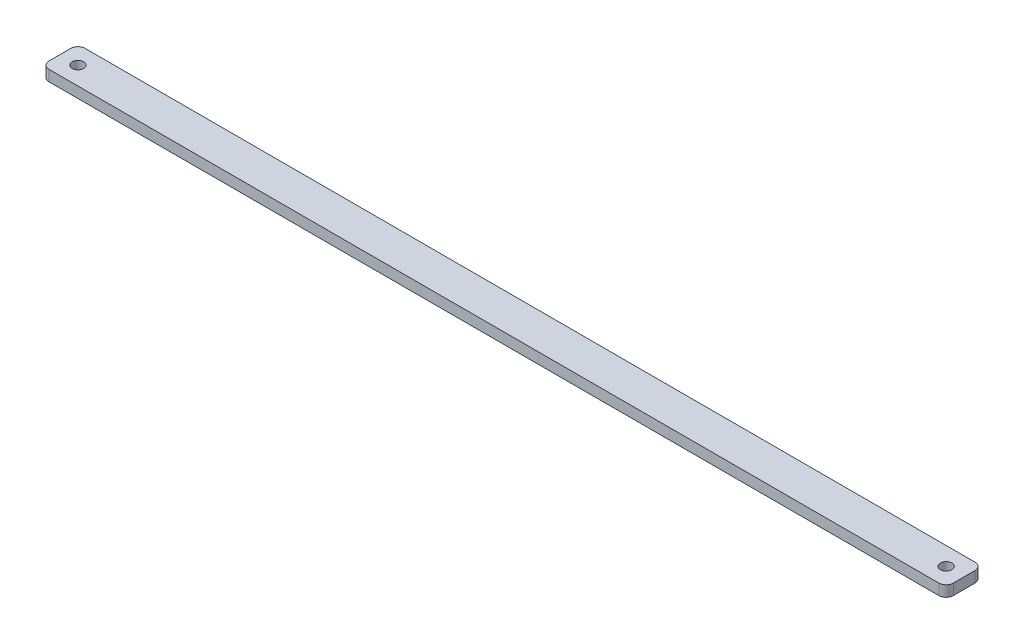
ISO-10303-21;
HEADER;
FILE_DESCRIPTION(('STEP AP214'),'2;1');
FILE_NAME('part.step','',(''),(''),'','','');
FILE_SCHEMA(('AUTOMOTIVE_DESIGN { 1 0 10303 214 1 1 1 1 }'));
ENDSEC;
DATA;
#1=APPLICATION_CONTEXT('core data for automotive mechanical design processes');
#2=APPLICATION_PROTOCOL_DEFINITION('international standard','automotive_design',2000,#1);
#3=PRODUCT_CONTEXT('',#1,'mechanical');
#4=PRODUCT('Part','Part','',(#3));
#5=PRODUCT_RELATED_PRODUCT_CATEGORY('part','',(#4));
#6=PRODUCT_DEFINITION_FORMATION('','',#4);
#7=PRODUCT_DEFINITION_CONTEXT('part definition',#1,'design');
#8=PRODUCT_DEFINITION('design','',#6,#7);
#9=PRODUCT_DEFINITION_SHAPE('','',#8);
#10=(LENGTH_UNIT() NAMED_UNIT(*) SI_UNIT(.MILLI.,.METRE.));
#11=(NAMED_UNIT(*) PLANE_ANGLE_UNIT() SI_UNIT($,.RADIAN.));
#12=(NAMED_UNIT(*) SI_UNIT($,.STERADIAN.) SOLID_ANGLE_UNIT());
#13=UNCERTAINTY_MEASURE_WITH_UNIT(LENGTH_MEASURE(1.E-05),#10,'distance_accuracy_value','');
#14=(GEOMETRIC_REPRESENTATION_CONTEXT(3) GLOBAL_UNCERTAINTY_ASSIGNED_CONTEXT((#13)) GLOBAL_UNIT_ASSIGNED_CONTEXT((#10,
#11,#12)) REPRESENTATION_CONTEXT('',''));
#15=CARTESIAN_POINT('',(0.,0.,0.));
#16=DIRECTION('',(0.,0.,1.));
#17=DIRECTION('',(1.,0.,0.));
#18=AXIS2_PLACEMENT_3D('',#15,#16,#17);
#19=CARTESIAN_POINT('',(0.,3.,0.));
#20=DIRECTION('',(0.,1.,0.));
#21=DIRECTION('',(0.,0.,1.));
#22=AXIS2_PLACEMENT_3D('',#19,#20,#21);
#23=PLANE('',#22);
#24=CARTESIAN_POINT('',(-120.,3.,0.));
#25=DIRECTION('',(0.,1.,0.));
#26=DIRECTION('',(0.,0.,1.));
#27=AXIS2_PLACEMENT_3D('',#24,#25,#26);
#28=CIRCLE('',#27,1.60000000000001);
#29=CARTESIAN_POINT('',(-120.,3.,1.60000000000002));
#30=VERTEX_POINT('',#29);
#31=EDGE_CURVE('E165',#30,#30,#28,.T.);
#32=ORIENTED_EDGE('',*,*,#31,.F.);
#33=EDGE_LOOP('',(#32));
#34=FACE_BOUND('',#33,.T.);
#35=DIRECTION('',(1.,0.,0.));
#36=VECTOR('',#35,1.);
#37=CARTESIAN_POINT('',(-125.,3.,5.00000000000002));
#38=LINE('',#37,#36);
#39=CARTESIAN_POINT('',(-123.,3.,5.00000000000002));
#40=VERTEX_POINT('',#39);
#41=CARTESIAN_POINT('',(123.,3.,5.00000000000002));
#42=VERTEX_POINT('',#41);
#43=EDGE_CURVE('E123',#40,#42,#38,.T.);
#44=ORIENTED_EDGE('',*,*,#43,.T.);
#45=CARTESIAN_POINT('',(123.,3.,3.00000000000002));
#46=DIRECTION('',(0.,1.,0.));
#47=DIRECTION('',(0.,0.,1.));
#48=AXIS2_PLACEMENT_3D('',#45,#46,#47);
#49=CIRCLE('',#48,2.);
#50=CARTESIAN_POINT('',(125.,3.,3.00000000000002));
#51=VERTEX_POINT('',#50);
#52=EDGE_CURVE('E156',#42,#51,#49,.T.);
#53=ORIENTED_EDGE('',*,*,#52,.T.);
#54=DIRECTION('',(0.,0.,-1.));
#55=VECTOR('',#54,1.);
#56=CARTESIAN_POINT('',(125.,3.,-4.99999999999999));
#57=LINE('',#56,#55);
#58=CARTESIAN_POINT('',(125.,3.,-2.99999999999998));
#59=VERTEX_POINT('',#58);
#60=EDGE_CURVE('E129',#51,#59,#57,.T.);
#61=ORIENTED_EDGE('',*,*,#60,.T.);
#62=CARTESIAN_POINT('',(123.,3.,-2.99999999999999));
#63=DIRECTION('',(0.,1.,0.));
#64=DIRECTION('',(0.,0.,1.));
#65=AXIS2_PLACEMENT_3D('',#62,#63,#64);
#66=CIRCLE('',#65,2.);
#67=CARTESIAN_POINT('',(123.,3.,-4.99999999999999));
#68=VERTEX_POINT('',#67);
#69=EDGE_CURVE('E59',#59,#68,#66,.T.);
#70=ORIENTED_EDGE('',*,*,#69,.T.);
#71=DIRECTION('',(-1.,0.,0.));
#72=VECTOR('',#71,1.);
#73=CARTESIAN_POINT('',(-125.,3.,-4.99999999999999));
#74=LINE('',#73,#72);
#75=CARTESIAN_POINT('',(-123.,3.,-4.99999999999999));
#76=VERTEX_POINT('',#75);
#77=EDGE_CURVE('E132',#68,#76,#74,.T.);
#78=ORIENTED_EDGE('',*,*,#77,.T.);
#79=CARTESIAN_POINT('',(-123.,3.,-2.99999999999999));
#80=DIRECTION('',(0.,1.,0.));
#81=DIRECTION('',(0.,0.,1.));
#82=AXIS2_PLACEMENT_3D('',#79,#80,#81);
#83=CIRCLE('',#82,2.);
#84=CARTESIAN_POINT('',(-125.,3.,-2.99999999999999));
#85=VERTEX_POINT('',#84);
#86=EDGE_CURVE('E153',#76,#85,#83,.T.);
#87=ORIENTED_EDGE('',*,*,#86,.T.);
#88=DIRECTION('',(0.,0.,1.));
#89=VECTOR('',#88,1.);
#90=CARTESIAN_POINT('',(-125.,3.,-4.99999999999999));
#91=LINE('',#90,#89);
#92=CARTESIAN_POINT('',(-125.,3.,3.00000000000002));
#93=VERTEX_POINT('',#92);
#94=EDGE_CURVE('E169',#85,#93,#91,.T.);
#95=ORIENTED_EDGE('',*,*,#94,.T.);
#96=CARTESIAN_POINT('',(-123.,3.,3.00000000000002));
#97=DIRECTION('',(0.,1.,0.));
#98=DIRECTION('',(0.,0.,1.));
#99=AXIS2_PLACEMENT_3D('',#96,#97,#98);
#100=CIRCLE('',#99,2.);
#101=EDGE_CURVE('E139',#93,#40,#100,.T.);
#102=ORIENTED_EDGE('',*,*,#101,.T.);
#103=EDGE_LOOP('',(#44,#53,#61,#70,#78,#87,#95,#102));
#104=FACE_BOUND('',#103,.T.);
#105=CARTESIAN_POINT('',(120.,3.,0.));
#106=DIRECTION('',(0.,1.,0.));
#107=DIRECTION('',(0.,0.,1.));
#108=AXIS2_PLACEMENT_3D('',#105,#106,#107);
#109=CIRCLE('',#108,1.60000000000001);
#110=CARTESIAN_POINT('',(120.,3.,1.59999999999999));
#111=VERTEX_POINT('',#110);
#112=EDGE_CURVE('E175',#111,#111,#109,.T.);
#113=ORIENTED_EDGE('',*,*,#112,.F.);
#114=EDGE_LOOP('',(#113));
#115=FACE_BOUND('',#114,.T.);
#116=ADVANCED_FACE('F37',(#34,#104,#115),#23,.T.);
#117=CARTESIAN_POINT('',(0.,0.,0.));
#118=DIRECTION('',(0.,1.,0.));
#119=DIRECTION('',(0.,0.,1.));
#120=AXIS2_PLACEMENT_3D('',#117,#118,#119);
#121=PLANE('',#120);
#122=DIRECTION('',(0.,0.,-1.));
#123=VECTOR('',#122,1.);
#124=CARTESIAN_POINT('',(125.,0.,-4.99999999999999));
#125=LINE('',#124,#123);
#126=CARTESIAN_POINT('',(125.,0.,3.00000000000002));
#127=VERTEX_POINT('',#126);
#128=CARTESIAN_POINT('',(125.,0.,-2.99999999999998));
#129=VERTEX_POINT('',#128);
#130=EDGE_CURVE('E164',#127,#129,#125,.T.);
#131=ORIENTED_EDGE('',*,*,#130,.F.);
#132=CARTESIAN_POINT('',(123.,0.,3.00000000000002));
#133=DIRECTION('',(0.,1.,0.));
#134=DIRECTION('',(0.,0.,1.));
#135=AXIS2_PLACEMENT_3D('',#132,#133,#134);
#136=CIRCLE('',#135,2.);
#137=CARTESIAN_POINT('',(123.,0.,5.00000000000002));
#138=VERTEX_POINT('',#137);
#139=EDGE_CURVE('E128',#127,#138,#136,.F.);
#140=ORIENTED_EDGE('',*,*,#139,.T.);
#141=DIRECTION('',(1.,0.,0.));
#142=VECTOR('',#141,1.);
#143=CARTESIAN_POINT('',(-125.,0.,5.00000000000002));
#144=LINE('',#143,#142);
#145=CARTESIAN_POINT('',(-123.,0.,5.00000000000002));
#146=VERTEX_POINT('',#145);
#147=EDGE_CURVE('E120',#146,#138,#144,.T.);
#148=ORIENTED_EDGE('',*,*,#147,.F.);
#149=CARTESIAN_POINT('',(-123.,0.,3.00000000000002));
#150=DIRECTION('',(0.,1.,0.));
#151=DIRECTION('',(0.,0.,1.));
#152=AXIS2_PLACEMENT_3D('',#149,#150,#151);
#153=CIRCLE('',#152,2.);
#154=CARTESIAN_POINT('',(-125.,0.,3.00000000000002));
#155=VERTEX_POINT('',#154);
#156=EDGE_CURVE('E105',#146,#155,#153,.F.);
#157=ORIENTED_EDGE('',*,*,#156,.T.);
#158=DIRECTION('',(0.,0.,1.));
#159=VECTOR('',#158,1.);
#160=CARTESIAN_POINT('',(-125.,0.,-4.99999999999999));
#161=LINE('',#160,#159);
#162=CARTESIAN_POINT('',(-125.,0.,-2.99999999999999));
#163=VERTEX_POINT('',#162);
#164=EDGE_CURVE('E130',#163,#155,#161,.T.);
#165=ORIENTED_EDGE('',*,*,#164,.F.);
#166=CARTESIAN_POINT('',(-123.,0.,-2.99999999999999));
#167=DIRECTION('',(0.,1.,0.));
#168=DIRECTION('',(0.,0.,1.));
#169=AXIS2_PLACEMENT_3D('',#166,#167,#168);
#170=CIRCLE('',#169,2.);
#171=CARTESIAN_POINT('',(-123.,0.,-4.99999999999999));
#172=VERTEX_POINT('',#171);
#173=EDGE_CURVE('E146',#163,#172,#170,.F.);
#174=ORIENTED_EDGE('',*,*,#173,.T.);
#175=DIRECTION('',(-1.,0.,0.));
#176=VECTOR('',#175,1.);
#177=CARTESIAN_POINT('',(-125.,0.,-4.99999999999999));
#178=LINE('',#177,#176);
#179=CARTESIAN_POINT('',(123.,0.,-4.99999999999999));
#180=VERTEX_POINT('',#179);
#181=EDGE_CURVE('E134',#180,#172,#178,.T.);
#182=ORIENTED_EDGE('',*,*,#181,.F.);
#183=CARTESIAN_POINT('',(123.,0.,-2.99999999999999));
#184=DIRECTION('',(0.,1.,0.));
#185=DIRECTION('',(0.,0.,1.));
#186=AXIS2_PLACEMENT_3D('',#183,#184,#185);
#187=CIRCLE('',#186,2.);
#188=EDGE_CURVE('E148',#180,#129,#187,.F.);
#189=ORIENTED_EDGE('',*,*,#188,.T.);
#190=EDGE_LOOP('',(#131,#140,#148,#157,#165,#174,#182,#189));
#191=FACE_BOUND('',#190,.T.);
#192=CARTESIAN_POINT('',(-120.,0.,0.));
#193=DIRECTION('',(0.,1.,0.));
#194=DIRECTION('',(0.,0.,1.));
#195=AXIS2_PLACEMENT_3D('',#192,#193,#194);
#196=CIRCLE('',#195,1.60000000000001);
#197=CARTESIAN_POINT('',(-120.,0.,1.60000000000002));
#198=VERTEX_POINT('',#197);
#199=EDGE_CURVE('E172',#198,#198,#196,.T.);
#200=ORIENTED_EDGE('',*,*,#199,.T.);
#201=EDGE_LOOP('',(#200));
#202=FACE_BOUND('',#201,.T.);
#203=CARTESIAN_POINT('',(120.,0.,0.));
#204=DIRECTION('',(0.,1.,0.));
#205=DIRECTION('',(0.,0.,1.));
#206=AXIS2_PLACEMENT_3D('',#203,#204,#205);
#207=CIRCLE('',#206,1.60000000000001);
#208=CARTESIAN_POINT('',(120.,0.,1.59999999999999));
#209=VERTEX_POINT('',#208);
#210=EDGE_CURVE('E178',#209,#209,#207,.T.);
#211=ORIENTED_EDGE('',*,*,#210,.T.);
#212=EDGE_LOOP('',(#211));
#213=FACE_BOUND('',#212,.T.);
#214=ADVANCED_FACE('F126',(#191,#202,#213),#121,.F.);
#215=CARTESIAN_POINT('',(125.,3.,-4.99999999999999));
#216=DIRECTION('',(-1.,0.,0.));
#217=DIRECTION('',(0.,0.,1.));
#218=AXIS2_PLACEMENT_3D('',#215,#216,#217);
#219=PLANE('',#218);
#220=ORIENTED_EDGE('',*,*,#60,.F.);
#221=DIRECTION('',(0.,-1.,0.));
#222=VECTOR('',#221,1.);
#223=CARTESIAN_POINT('',(125.,3.,3.00000000000002));
#224=LINE('',#223,#222);
#225=EDGE_CURVE('E143',#51,#127,#224,.T.);
#226=ORIENTED_EDGE('',*,*,#225,.T.);
#227=ORIENTED_EDGE('',*,*,#130,.T.);
#228=DIRECTION('',(0.,-1.,0.));
#229=VECTOR('',#228,1.);
#230=CARTESIAN_POINT('',(125.,3.,-2.99999999999998));
#231=LINE('',#230,#229);
#232=EDGE_CURVE('E141',#129,#59,#231,.F.);
#233=ORIENTED_EDGE('',*,*,#232,.T.);
#234=EDGE_LOOP('',(#220,#226,#227,#233));
#235=FACE_BOUND('',#234,.T.);
#236=ADVANCED_FACE('F193',(#235),#219,.F.);
#237=CARTESIAN_POINT('',(-125.,3.,-4.99999999999999));
#238=DIRECTION('',(0.,0.,1.));
#239=DIRECTION('',(1.,0.,0.));
#240=AXIS2_PLACEMENT_3D('',#237,#238,#239);
#241=PLANE('',#240);
#242=ORIENTED_EDGE('',*,*,#77,.F.);
#243=DIRECTION('',(0.,-1.,0.));
#244=VECTOR('',#243,1.);
#245=CARTESIAN_POINT('',(123.,3.,-4.99999999999999));
#246=LINE('',#245,#244);
#247=EDGE_CURVE('E45',#68,#180,#246,.T.);
#248=ORIENTED_EDGE('',*,*,#247,.T.);
#249=ORIENTED_EDGE('',*,*,#181,.T.);
#250=DIRECTION('',(0.,-1.,0.));
#251=VECTOR('',#250,1.);
#252=CARTESIAN_POINT('',(-123.,3.,-4.99999999999999));
#253=LINE('',#252,#251);
#254=EDGE_CURVE('E52',#172,#76,#253,.F.);
#255=ORIENTED_EDGE('',*,*,#254,.T.);
#256=EDGE_LOOP('',(#242,#248,#249,#255));
#257=FACE_BOUND('',#256,.T.);
#258=ADVANCED_FACE('F161',(#257),#241,.F.);
#259=CARTESIAN_POINT('',(-125.,3.,-4.99999999999999));
#260=DIRECTION('',(1.,0.,0.));
#261=DIRECTION('',(0.,0.,-1.));
#262=AXIS2_PLACEMENT_3D('',#259,#260,#261);
#263=PLANE('',#262);
#264=ORIENTED_EDGE('',*,*,#94,.F.);
#265=DIRECTION('',(0.,-1.,0.));
#266=VECTOR('',#265,1.);
#267=CARTESIAN_POINT('',(-125.,3.,-2.99999999999999));
#268=LINE('',#267,#266);
#269=EDGE_CURVE('E11',#85,#163,#268,.T.);
#270=ORIENTED_EDGE('',*,*,#269,.T.);
#271=ORIENTED_EDGE('',*,*,#164,.T.);
#272=DIRECTION('',(0.,-1.,0.));
#273=VECTOR('',#272,1.);
#274=CARTESIAN_POINT('',(-125.,3.,3.00000000000002));
#275=LINE('',#274,#273);
#276=EDGE_CURVE('E111',#155,#93,#275,.F.);
#277=ORIENTED_EDGE('',*,*,#276,.T.);
#278=EDGE_LOOP('',(#264,#270,#271,#277));
#279=FACE_BOUND('',#278,.T.);
#280=ADVANCED_FACE('F202',(#279),#263,.F.);
#281=CARTESIAN_POINT('',(-125.,3.,5.00000000000002));
#282=DIRECTION('',(0.,0.,-1.));
#283=DIRECTION('',(-1.,0.,0.));
#284=AXIS2_PLACEMENT_3D('',#281,#282,#283);
#285=PLANE('',#284);
#286=ORIENTED_EDGE('',*,*,#147,.T.);
#287=DIRECTION('',(0.,-1.,0.));
#288=VECTOR('',#287,1.);
#289=CARTESIAN_POINT('',(123.,3.,5.00000000000002));
#290=LINE('',#289,#288);
#291=EDGE_CURVE('E151',#138,#42,#290,.F.);
#292=ORIENTED_EDGE('',*,*,#291,.T.);
#293=ORIENTED_EDGE('',*,*,#43,.F.);
#294=DIRECTION('',(0.,-1.,0.));
#295=VECTOR('',#294,1.);
#296=CARTESIAN_POINT('',(-123.,3.,5.00000000000002));
#297=LINE('',#296,#295);
#298=EDGE_CURVE('E109',#40,#146,#297,.T.);
#299=ORIENTED_EDGE('',*,*,#298,.T.);
#300=EDGE_LOOP('',(#286,#292,#293,#299));
#301=FACE_BOUND('',#300,.T.);
#302=ADVANCED_FACE('F119',(#301),#285,.F.);
#303=CARTESIAN_POINT('',(-120.,3.,0.));
#304=DIRECTION('',(0.,-1.,0.));
#305=DIRECTION('',(0.,0.,-1.));
#306=AXIS2_PLACEMENT_3D('',#303,#304,#305);
#307=CYLINDRICAL_SURFACE('',#306,1.60000000000001);
#308=ORIENTED_EDGE('',*,*,#31,.T.);
#309=EDGE_LOOP('',(#308));
#310=FACE_BOUND('',#309,.T.);
#311=ORIENTED_EDGE('',*,*,#199,.F.);
#312=EDGE_LOOP('',(#311));
#313=FACE_BOUND('',#312,.T.);
#314=ADVANCED_FACE('F197',(#310,#313),#307,.F.);
#315=CARTESIAN_POINT('',(120.,3.,0.));
#316=DIRECTION('',(0.,-1.,0.));
#317=DIRECTION('',(0.,0.,-1.));
#318=AXIS2_PLACEMENT_3D('',#315,#316,#317);
#319=CYLINDRICAL_SURFACE('',#318,1.60000000000001);
#320=ORIENTED_EDGE('',*,*,#112,.T.);
#321=EDGE_LOOP('',(#320));
#322=FACE_BOUND('',#321,.T.);
#323=ORIENTED_EDGE('',*,*,#210,.F.);
#324=EDGE_LOOP('',(#323));
#325=FACE_BOUND('',#324,.T.);
#326=ADVANCED_FACE('F184',(#322,#325),#319,.F.);
#327=CARTESIAN_POINT('',(-123.,3.,3.00000000000002));
#328=DIRECTION('',(0.,-1.,0.));
#329=DIRECTION('',(0.,0.,-1.));
#330=AXIS2_PLACEMENT_3D('',#327,#328,#329);
#331=CYLINDRICAL_SURFACE('',#330,2.);
#332=ORIENTED_EDGE('',*,*,#101,.F.);
#333=ORIENTED_EDGE('',*,*,#276,.F.);
#334=ORIENTED_EDGE('',*,*,#156,.F.);
#335=ORIENTED_EDGE('',*,*,#298,.F.);
#336=EDGE_LOOP('',(#332,#333,#334,#335));
#337=FACE_BOUND('',#336,.T.);
#338=ADVANCED_FACE('F108',(#337),#331,.T.);
#339=CARTESIAN_POINT('',(123.,3.,3.00000000000002));
#340=DIRECTION('',(0.,-1.,0.));
#341=DIRECTION('',(0.,0.,-1.));
#342=AXIS2_PLACEMENT_3D('',#339,#340,#341);
#343=CYLINDRICAL_SURFACE('',#342,2.);
#344=ORIENTED_EDGE('',*,*,#52,.F.);
#345=ORIENTED_EDGE('',*,*,#291,.F.);
#346=ORIENTED_EDGE('',*,*,#139,.F.);
#347=ORIENTED_EDGE('',*,*,#225,.F.);
#348=EDGE_LOOP('',(#344,#345,#346,#347));
#349=FACE_BOUND('',#348,.T.);
#350=ADVANCED_FACE('F213',(#349),#343,.T.);
#351=CARTESIAN_POINT('',(123.,3.,-2.99999999999999));
#352=DIRECTION('',(0.,-1.,0.));
#353=DIRECTION('',(0.,0.,-1.));
#354=AXIS2_PLACEMENT_3D('',#351,#352,#353);
#355=CYLINDRICAL_SURFACE('',#354,2.);
#356=ORIENTED_EDGE('',*,*,#69,.F.);
#357=ORIENTED_EDGE('',*,*,#232,.F.);
#358=ORIENTED_EDGE('',*,*,#188,.F.);
#359=ORIENTED_EDGE('',*,*,#247,.F.);
#360=EDGE_LOOP('',(#356,#357,#358,#359));
#361=FACE_BOUND('',#360,.T.);
#362=ADVANCED_FACE('F215',(#361),#355,.T.);
#363=CARTESIAN_POINT('',(-123.,3.,-2.99999999999999));
#364=DIRECTION('',(0.,-1.,0.));
#365=DIRECTION('',(0.,0.,-1.));
#366=AXIS2_PLACEMENT_3D('',#363,#364,#365);
#367=CYLINDRICAL_SURFACE('',#366,2.);
#368=ORIENTED_EDGE('',*,*,#86,.F.);
#369=ORIENTED_EDGE('',*,*,#254,.F.);
#370=ORIENTED_EDGE('',*,*,#173,.F.);
#371=ORIENTED_EDGE('',*,*,#269,.F.);
#372=EDGE_LOOP('',(#368,#369,#370,#371));
#373=FACE_BOUND('',#372,.T.);
#374=ADVANCED_FACE('F39',(#373),#367,.T.);
#375=CLOSED_SHELL('',(#116,#214,#236,#258,#280,#302,#314,#326,#338,#350,#362,#374));
#376=MANIFOLD_SOLID_BREP('B2',#375);
#377=ADVANCED_BREP_SHAPE_REPRESENTATION('',(#18,#376),#14);
#378=SHAPE_DEFINITION_REPRESENTATION(#9,#377);
ENDSEC;
END-ISO-10303-21;
